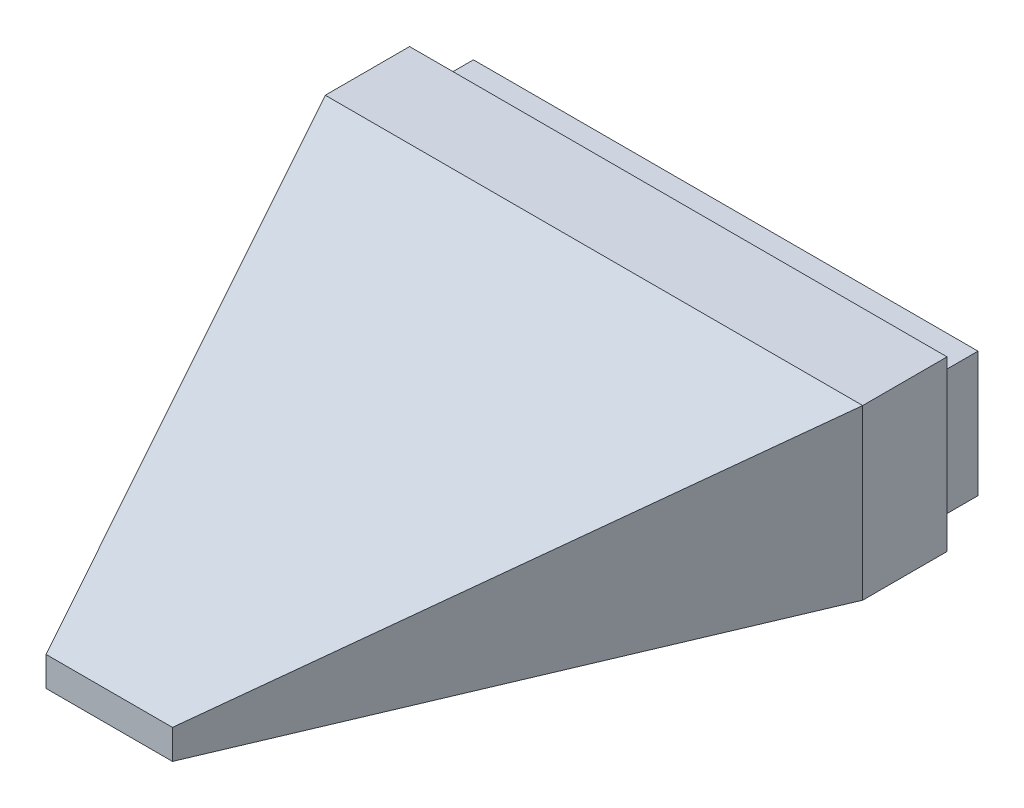
ISO-10303-21;
HEADER;
FILE_DESCRIPTION(('STEP AP214'),'2;1');
FILE_NAME('part.step','',(''),(''),'','','');
FILE_SCHEMA(('AUTOMOTIVE_DESIGN { 1 0 10303 214 1 1 1 1 }'));
ENDSEC;
DATA;
#1=APPLICATION_CONTEXT('core data for automotive mechanical design processes');
#2=APPLICATION_PROTOCOL_DEFINITION('international standard','automotive_design',2000,#1);
#3=PRODUCT_CONTEXT('',#1,'mechanical');
#4=PRODUCT('Part','Part','',(#3));
#5=PRODUCT_RELATED_PRODUCT_CATEGORY('part','',(#4));
#6=PRODUCT_DEFINITION_FORMATION('','',#4);
#7=PRODUCT_DEFINITION_CONTEXT('part definition',#1,'design');
#8=PRODUCT_DEFINITION('design','',#6,#7);
#9=PRODUCT_DEFINITION_SHAPE('','',#8);
#10=(LENGTH_UNIT() NAMED_UNIT(*) SI_UNIT(.MILLI.,.METRE.));
#11=(NAMED_UNIT(*) PLANE_ANGLE_UNIT() SI_UNIT($,.RADIAN.));
#12=(NAMED_UNIT(*) SI_UNIT($,.STERADIAN.) SOLID_ANGLE_UNIT());
#13=UNCERTAINTY_MEASURE_WITH_UNIT(LENGTH_MEASURE(1.E-05),#10,'distance_accuracy_value','');
#14=(GEOMETRIC_REPRESENTATION_CONTEXT(3) GLOBAL_UNCERTAINTY_ASSIGNED_CONTEXT((#13)) GLOBAL_UNIT_ASSIGNED_CONTEXT((#10,
#11,#12)) REPRESENTATION_CONTEXT('',''));
#15=CARTESIAN_POINT('',(0.,0.,0.));
#16=DIRECTION('',(0.,0.,1.));
#17=DIRECTION('',(1.,0.,0.));
#18=AXIS2_PLACEMENT_3D('',#15,#16,#17);
#19=CARTESIAN_POINT('',(0.,0.,0.));
#20=DIRECTION('',(0.,0.,1.));
#21=DIRECTION('',(1.,0.,0.));
#22=AXIS2_PLACEMENT_3D('',#19,#20,#21);
#23=PLANE('',#22);
#24=DIRECTION('',(0.,-1.,0.));
#25=VECTOR('',#24,1.);
#26=CARTESIAN_POINT('',(-63.75,-20.,0.));
#27=LINE('',#26,#25);
#28=CARTESIAN_POINT('',(-63.75,20.,0.));
#29=VERTEX_POINT('',#28);
#30=CARTESIAN_POINT('',(-63.75,-20.,0.));
#31=VERTEX_POINT('',#30);
#32=EDGE_CURVE('E345',#29,#31,#27,.T.);
#33=ORIENTED_EDGE('',*,*,#32,.F.);
#34=DIRECTION('',(-1.,0.,0.));
#35=VECTOR('',#34,1.);
#36=CARTESIAN_POINT('',(63.75,20.,0.));
#37=LINE('',#36,#35);
#38=CARTESIAN_POINT('',(63.75,20.,0.));
#39=VERTEX_POINT('',#38);
#40=EDGE_CURVE('E351',#39,#29,#37,.T.);
#41=ORIENTED_EDGE('',*,*,#40,.F.);
#42=DIRECTION('',(0.,1.,0.));
#43=VECTOR('',#42,1.);
#44=CARTESIAN_POINT('',(63.75,-20.,0.));
#45=LINE('',#44,#43);
#46=CARTESIAN_POINT('',(63.75,-20.,0.));
#47=VERTEX_POINT('',#46);
#48=EDGE_CURVE('E359',#47,#39,#45,.T.);
#49=ORIENTED_EDGE('',*,*,#48,.F.);
#50=DIRECTION('',(1.,0.,0.));
#51=VECTOR('',#50,1.);
#52=CARTESIAN_POINT('',(63.75,-20.,0.));
#53=LINE('',#52,#51);
#54=EDGE_CURVE('E355',#31,#47,#53,.T.);
#55=ORIENTED_EDGE('',*,*,#54,.F.);
#56=EDGE_LOOP('',(#33,#41,#49,#55));
#57=FACE_BOUND('',#56,.T.);
#58=DIRECTION('',(0.,1.,0.));
#59=VECTOR('',#58,1.);
#60=CARTESIAN_POINT('',(-58.6,14.85,0.));
#61=LINE('',#60,#59);
#62=CARTESIAN_POINT('',(-58.6,-14.85,0.));
#63=VERTEX_POINT('',#62);
#64=CARTESIAN_POINT('',(-58.6,14.85,0.));
#65=VERTEX_POINT('',#64);
#66=EDGE_CURVE('E300',#63,#65,#61,.T.);
#67=ORIENTED_EDGE('',*,*,#66,.F.);
#68=DIRECTION('',(-1.,0.,0.));
#69=VECTOR('',#68,1.);
#70=CARTESIAN_POINT('',(-58.6,-14.85,0.));
#71=LINE('',#70,#69);
#72=CARTESIAN_POINT('',(61.1,-14.85,0.));
#73=VERTEX_POINT('',#72);
#74=EDGE_CURVE('E306',#73,#63,#71,.T.);
#75=ORIENTED_EDGE('',*,*,#74,.F.);
#76=DIRECTION('',(0.,-1.,0.));
#77=VECTOR('',#76,1.);
#78=CARTESIAN_POINT('',(61.1,14.85,0.));
#79=LINE('',#78,#77);
#80=CARTESIAN_POINT('',(61.1,14.85,0.));
#81=VERTEX_POINT('',#80);
#82=EDGE_CURVE('E323',#81,#73,#79,.T.);
#83=ORIENTED_EDGE('',*,*,#82,.F.);
#84=DIRECTION('',(1.,0.,0.));
#85=VECTOR('',#84,1.);
#86=CARTESIAN_POINT('',(-58.6,14.85,0.));
#87=LINE('',#86,#85);
#88=EDGE_CURVE('E319',#65,#81,#87,.T.);
#89=ORIENTED_EDGE('',*,*,#88,.F.);
#90=EDGE_LOOP('',(#67,#75,#83,#89));
#91=FACE_BOUND('',#90,.T.);
#92=ADVANCED_FACE('F45',(#57,#91),#23,.F.);
#93=CARTESIAN_POINT('',(-63.75,-20.,135.));
#94=DIRECTION('',(1.,0.,0.));
#95=DIRECTION('',(0.,0.,-1.));
#96=AXIS2_PLACEMENT_3D('',#93,#94,#95);
#97=PLANE('',#96);
#98=DIRECTION('',(0.,0.,-1.));
#99=VECTOR('',#98,1.);
#100=CARTESIAN_POINT('',(-63.75,-20.,135.));
#101=LINE('',#100,#99);
#102=CARTESIAN_POINT('',(-63.75,-20.,20.));
#103=VERTEX_POINT('',#102);
#104=EDGE_CURVE('E374',#103,#31,#101,.T.);
#105=ORIENTED_EDGE('',*,*,#104,.F.);
#106=DIRECTION('',(0.,1.,0.));
#107=VECTOR('',#106,1.);
#108=CARTESIAN_POINT('',(-63.75,-164.,20.));
#109=LINE('',#108,#107);
#110=CARTESIAN_POINT('',(-63.75,20.,20.));
#111=VERTEX_POINT('',#110);
#112=EDGE_CURVE('E276',#103,#111,#109,.T.);
#113=ORIENTED_EDGE('',*,*,#112,.T.);
#114=DIRECTION('',(0.,0.,-1.));
#115=VECTOR('',#114,1.);
#116=CARTESIAN_POINT('',(-63.75,20.,135.));
#117=LINE('',#116,#115);
#118=EDGE_CURVE('E350',#111,#29,#117,.T.);
#119=ORIENTED_EDGE('',*,*,#118,.T.);
#120=ORIENTED_EDGE('',*,*,#32,.T.);
#121=EDGE_LOOP('',(#105,#113,#119,#120));
#122=FACE_BOUND('',#121,.T.);
#123=ADVANCED_FACE('F47',(#122),#97,.F.);
#124=CARTESIAN_POINT('',(63.75,-20.,135.));
#125=DIRECTION('',(0.,1.,0.));
#126=DIRECTION('',(-1.,0.,0.));
#127=AXIS2_PLACEMENT_3D('',#124,#125,#126);
#128=PLANE('',#127);
#129=DIRECTION('',(-0.390292829474369,0.,-0.920690777221588));
#130=VECTOR('',#129,1.);
#131=CARTESIAN_POINT('',(1.59932268931276,-20.,161.346482773009));
#132=LINE('',#131,#130);
#133=CARTESIAN_POINT('',(-11.6888602253323,-20.,130.));
#134=VERTEX_POINT('',#133);
#135=CARTESIAN_POINT('',(-58.75,-20.,18.9839779674504));
#136=VERTEX_POINT('',#135);
#137=EDGE_CURVE('E262',#134,#136,#132,.T.);
#138=ORIENTED_EDGE('',*,*,#137,.F.);
#139=DIRECTION('',(1.,0.,0.));
#140=VECTOR('',#139,1.);
#141=CARTESIAN_POINT('',(63.75,-20.,130.));
#142=LINE('',#141,#140);
#143=CARTESIAN_POINT('',(11.6888602253323,-20.,130.));
#144=VERTEX_POINT('',#143);
#145=EDGE_CURVE('E264',#134,#144,#142,.T.);
#146=ORIENTED_EDGE('',*,*,#145,.T.);
#147=DIRECTION('',(-0.390292829474369,0.,0.920690777221588));
#148=VECTOR('',#147,1.);
#149=CARTESIAN_POINT('',(17.8225601349236,-20.,115.530759187631));
#150=LINE('',#149,#148);
#151=CARTESIAN_POINT('',(58.75,-20.,18.9839779674504));
#152=VERTEX_POINT('',#151);
#153=EDGE_CURVE('E258',#152,#144,#150,.T.);
#154=ORIENTED_EDGE('',*,*,#153,.F.);
#155=DIRECTION('',(0.,0.,-1.));
#156=VECTOR('',#155,1.);
#157=CARTESIAN_POINT('',(58.75,-20.,135.));
#158=LINE('',#157,#156);
#159=CARTESIAN_POINT('',(58.75,-20.,5.));
#160=VERTEX_POINT('',#159);
#161=EDGE_CURVE('E61',#152,#160,#158,.T.);
#162=ORIENTED_EDGE('',*,*,#161,.T.);
#163=DIRECTION('',(1.,0.,0.));
#164=VECTOR('',#163,1.);
#165=CARTESIAN_POINT('',(63.75,-20.,5.));
#166=LINE('',#165,#164);
#167=CARTESIAN_POINT('',(-58.75,-20.,5.));
#168=VERTEX_POINT('',#167);
#169=EDGE_CURVE('E249',#168,#160,#166,.T.);
#170=ORIENTED_EDGE('',*,*,#169,.F.);
#171=DIRECTION('',(0.,0.,-1.));
#172=VECTOR('',#171,1.);
#173=CARTESIAN_POINT('',(-58.75,-20.,135.));
#174=LINE('',#173,#172);
#175=EDGE_CURVE('E256',#136,#168,#174,.T.);
#176=ORIENTED_EDGE('',*,*,#175,.F.);
#177=EDGE_LOOP('',(#138,#146,#154,#162,#170,#176));
#178=FACE_BOUND('',#177,.T.);
#179=DIRECTION('',(1.,0.,0.));
#180=VECTOR('',#179,1.);
#181=CARTESIAN_POINT('',(63.75,-20.,135.));
#182=LINE('',#181,#180);
#183=CARTESIAN_POINT('',(-15.,-20.,135.));
#184=VERTEX_POINT('',#183);
#185=CARTESIAN_POINT('',(15.,-20.,135.));
#186=VERTEX_POINT('',#185);
#187=EDGE_CURVE('E346',#184,#186,#182,.T.);
#188=ORIENTED_EDGE('',*,*,#187,.F.);
#189=DIRECTION('',(-0.390292829474369,0.,-0.920690777221588));
#190=VECTOR('',#189,1.);
#191=CARTESIAN_POINT('',(-3.00413119679517,-20.,163.297946920381));
#192=LINE('',#191,#190);
#193=EDGE_CURVE('E292',#184,#103,#192,.T.);
#194=ORIENTED_EDGE('',*,*,#193,.T.);
#195=ORIENTED_EDGE('',*,*,#104,.T.);
#196=ORIENTED_EDGE('',*,*,#54,.T.);
#197=DIRECTION('',(0.,0.,-1.));
#198=VECTOR('',#197,1.);
#199=CARTESIAN_POINT('',(63.75,-20.,135.));
#200=LINE('',#199,#198);
#201=CARTESIAN_POINT('',(63.75,-20.,20.));
#202=VERTEX_POINT('',#201);
#203=EDGE_CURVE('E371',#202,#47,#200,.T.);
#204=ORIENTED_EDGE('',*,*,#203,.F.);
#205=DIRECTION('',(-0.390292829474369,0.,0.920690777221588));
#206=VECTOR('',#205,1.);
#207=CARTESIAN_POINT('',(22.4260140210315,-20.,117.482223335003));
#208=LINE('',#207,#206);
#209=EDGE_CURVE('E280',#202,#186,#208,.T.);
#210=ORIENTED_EDGE('',*,*,#209,.T.);
#211=EDGE_LOOP('',(#188,#194,#195,#196,#204,#210));
#212=FACE_BOUND('',#211,.T.);
#213=ADVANCED_FACE('F406',(#178,#212),#128,.F.);
#214=CARTESIAN_POINT('',(63.75,-20.,135.));
#215=DIRECTION('',(-1.,0.,0.));
#216=DIRECTION('',(0.,0.,1.));
#217=AXIS2_PLACEMENT_3D('',#214,#215,#216);
#218=PLANE('',#217);
#219=DIRECTION('',(0.,0.,-1.));
#220=VECTOR('',#219,1.);
#221=CARTESIAN_POINT('',(63.75,20.,135.));
#222=LINE('',#221,#220);
#223=CARTESIAN_POINT('',(63.75,20.,20.));
#224=VERTEX_POINT('',#223);
#225=EDGE_CURVE('E368',#224,#39,#222,.T.);
#226=ORIENTED_EDGE('',*,*,#225,.F.);
#227=DIRECTION('',(0.,1.,0.));
#228=VECTOR('',#227,1.);
#229=CARTESIAN_POINT('',(63.75,-164.,20.));
#230=LINE('',#229,#228);
#231=EDGE_CURVE('E248',#202,#224,#230,.T.);
#232=ORIENTED_EDGE('',*,*,#231,.F.);
#233=ORIENTED_EDGE('',*,*,#203,.T.);
#234=ORIENTED_EDGE('',*,*,#48,.T.);
#235=EDGE_LOOP('',(#226,#232,#233,#234));
#236=FACE_BOUND('',#235,.T.);
#237=ADVANCED_FACE('F393',(#236),#218,.F.);
#238=CARTESIAN_POINT('',(63.75,20.,135.));
#239=DIRECTION('',(0.,-1.,0.));
#240=DIRECTION('',(1.,0.,0.));
#241=AXIS2_PLACEMENT_3D('',#238,#239,#240);
#242=PLANE('',#241);
#243=ORIENTED_EDGE('',*,*,#118,.F.);
#244=DIRECTION('',(-1.,0.,0.));
#245=VECTOR('',#244,1.);
#246=CARTESIAN_POINT('',(120.25,20.,20.));
#247=LINE('',#246,#245);
#248=EDGE_CURVE('E296',#224,#111,#247,.T.);
#249=ORIENTED_EDGE('',*,*,#248,.F.);
#250=ORIENTED_EDGE('',*,*,#225,.T.);
#251=ORIENTED_EDGE('',*,*,#40,.T.);
#252=EDGE_LOOP('',(#243,#249,#250,#251));
#253=FACE_BOUND('',#252,.T.);
#254=ADVANCED_FACE('F390',(#253),#242,.F.);
#255=CARTESIAN_POINT('',(0.,0.,135.));
#256=DIRECTION('',(0.,0.,1.));
#257=DIRECTION('',(1.,0.,0.));
#258=AXIS2_PLACEMENT_3D('',#255,#256,#257);
#259=PLANE('',#258);
#260=DIRECTION('',(0.,1.,0.));
#261=VECTOR('',#260,1.);
#262=CARTESIAN_POINT('',(-15.,-164.,135.));
#263=LINE('',#262,#261);
#264=CARTESIAN_POINT('',(-15.,-13.,135.));
#265=VERTEX_POINT('',#264);
#266=EDGE_CURVE('E69',#184,#265,#263,.T.);
#267=ORIENTED_EDGE('',*,*,#266,.F.);
#268=ORIENTED_EDGE('',*,*,#187,.T.);
#269=DIRECTION('',(0.,1.,0.));
#270=VECTOR('',#269,1.);
#271=CARTESIAN_POINT('',(15.,-164.,135.));
#272=LINE('',#271,#270);
#273=CARTESIAN_POINT('',(15.,-13.,135.));
#274=VERTEX_POINT('',#273);
#275=EDGE_CURVE('E283',#186,#274,#272,.T.);
#276=ORIENTED_EDGE('',*,*,#275,.T.);
#277=DIRECTION('',(1.,0.,0.));
#278=VECTOR('',#277,1.);
#279=CARTESIAN_POINT('',(0.,-13.,135.));
#280=LINE('',#279,#278);
#281=EDGE_CURVE('E377',#265,#274,#280,.T.);
#282=ORIENTED_EDGE('',*,*,#281,.F.);
#283=EDGE_LOOP('',(#267,#268,#276,#282));
#284=FACE_BOUND('',#283,.T.);
#285=ADVANCED_FACE('F408',(#284),#259,.T.);
#286=CARTESIAN_POINT('',(-58.6,14.85,-10.));
#287=DIRECTION('',(1.,0.,0.));
#288=DIRECTION('',(0.,1.,0.));
#289=AXIS2_PLACEMENT_3D('',#286,#287,#288);
#290=PLANE('',#289);
#291=ORIENTED_EDGE('',*,*,#66,.T.);
#292=DIRECTION('',(0.,0.,1.));
#293=VECTOR('',#292,1.);
#294=CARTESIAN_POINT('',(-58.6,14.85,-10.));
#295=LINE('',#294,#293);
#296=CARTESIAN_POINT('',(-58.6,14.85,-10.));
#297=VERTEX_POINT('',#296);
#298=EDGE_CURVE('E341',#297,#65,#295,.T.);
#299=ORIENTED_EDGE('',*,*,#298,.F.);
#300=DIRECTION('',(0.,1.,0.));
#301=VECTOR('',#300,1.);
#302=CARTESIAN_POINT('',(-58.6,14.85,-10.));
#303=LINE('',#302,#301);
#304=CARTESIAN_POINT('',(-58.6,-14.85,-10.));
#305=VERTEX_POINT('',#304);
#306=EDGE_CURVE('E301',#305,#297,#303,.T.);
#307=ORIENTED_EDGE('',*,*,#306,.F.);
#308=DIRECTION('',(0.,0.,1.));
#309=VECTOR('',#308,1.);
#310=CARTESIAN_POINT('',(-58.6,-14.85,-10.));
#311=LINE('',#310,#309);
#312=EDGE_CURVE('E315',#305,#63,#311,.T.);
#313=ORIENTED_EDGE('',*,*,#312,.T.);
#314=EDGE_LOOP('',(#291,#299,#307,#313));
#315=FACE_BOUND('',#314,.T.);
#316=ADVANCED_FACE('F656',(#315),#290,.F.);
#317=CARTESIAN_POINT('',(-58.6,14.85,-10.));
#318=DIRECTION('',(0.,-1.,0.));
#319=DIRECTION('',(1.,0.,0.));
#320=AXIS2_PLACEMENT_3D('',#317,#318,#319);
#321=PLANE('',#320);
#322=ORIENTED_EDGE('',*,*,#88,.T.);
#323=DIRECTION('',(0.,0.,1.));
#324=VECTOR('',#323,1.);
#325=CARTESIAN_POINT('',(61.1,14.85,-10.));
#326=LINE('',#325,#324);
#327=CARTESIAN_POINT('',(61.1,14.85,-10.));
#328=VERTEX_POINT('',#327);
#329=EDGE_CURVE('E337',#328,#81,#326,.T.);
#330=ORIENTED_EDGE('',*,*,#329,.F.);
#331=DIRECTION('',(1.,0.,0.));
#332=VECTOR('',#331,1.);
#333=CARTESIAN_POINT('',(-58.6,14.85,-10.));
#334=LINE('',#333,#332);
#335=EDGE_CURVE('E305',#297,#328,#334,.T.);
#336=ORIENTED_EDGE('',*,*,#335,.F.);
#337=ORIENTED_EDGE('',*,*,#298,.T.);
#338=EDGE_LOOP('',(#322,#330,#336,#337));
#339=FACE_BOUND('',#338,.T.);
#340=ADVANCED_FACE('F646',(#339),#321,.F.);
#341=CARTESIAN_POINT('',(61.1,14.85,-10.));
#342=DIRECTION('',(-1.,0.,0.));
#343=DIRECTION('',(0.,-1.,0.));
#344=AXIS2_PLACEMENT_3D('',#341,#342,#343);
#345=PLANE('',#344);
#346=ORIENTED_EDGE('',*,*,#82,.T.);
#347=DIRECTION('',(0.,0.,1.));
#348=VECTOR('',#347,1.);
#349=CARTESIAN_POINT('',(61.1,-14.85,-10.));
#350=LINE('',#349,#348);
#351=CARTESIAN_POINT('',(61.1,-14.85,-10.));
#352=VERTEX_POINT('',#351);
#353=EDGE_CURVE('E333',#352,#73,#350,.T.);
#354=ORIENTED_EDGE('',*,*,#353,.F.);
#355=DIRECTION('',(0.,-1.,0.));
#356=VECTOR('',#355,1.);
#357=CARTESIAN_POINT('',(61.1,14.85,-10.));
#358=LINE('',#357,#356);
#359=EDGE_CURVE('E309',#328,#352,#358,.T.);
#360=ORIENTED_EDGE('',*,*,#359,.F.);
#361=ORIENTED_EDGE('',*,*,#329,.T.);
#362=EDGE_LOOP('',(#346,#354,#360,#361));
#363=FACE_BOUND('',#362,.T.);
#364=ADVANCED_FACE('F636',(#363),#345,.F.);
#365=CARTESIAN_POINT('',(-58.6,-14.85,-10.));
#366=DIRECTION('',(0.,1.,0.));
#367=DIRECTION('',(-1.,0.,0.));
#368=AXIS2_PLACEMENT_3D('',#365,#366,#367);
#369=PLANE('',#368);
#370=ORIENTED_EDGE('',*,*,#74,.T.);
#371=ORIENTED_EDGE('',*,*,#312,.F.);
#372=DIRECTION('',(-1.,0.,0.));
#373=VECTOR('',#372,1.);
#374=CARTESIAN_POINT('',(-58.6,-14.85,-10.));
#375=LINE('',#374,#373);
#376=EDGE_CURVE('E312',#352,#305,#375,.T.);
#377=ORIENTED_EDGE('',*,*,#376,.F.);
#378=ORIENTED_EDGE('',*,*,#353,.T.);
#379=EDGE_LOOP('',(#370,#371,#377,#378));
#380=FACE_BOUND('',#379,.T.);
#381=ADVANCED_FACE('F626',(#380),#369,.F.);
#382=CARTESIAN_POINT('',(0.,0.,-10.));
#383=DIRECTION('',(0.,0.,1.));
#384=DIRECTION('',(1.,0.,0.));
#385=AXIS2_PLACEMENT_3D('',#382,#383,#384);
#386=PLANE('',#385);
#387=ORIENTED_EDGE('',*,*,#306,.T.);
#388=ORIENTED_EDGE('',*,*,#335,.T.);
#389=ORIENTED_EDGE('',*,*,#359,.T.);
#390=ORIENTED_EDGE('',*,*,#376,.T.);
#391=EDGE_LOOP('',(#387,#388,#389,#390));
#392=FACE_BOUND('',#391,.T.);
#393=ADVANCED_FACE('F417',(#392),#386,.F.);
#394=CARTESIAN_POINT('',(120.25,23.7809137906944,6.82408830515579));
#395=DIRECTION('',(0.,-0.961207905262158,-0.275824877162185));
#396=DIRECTION('',(0.,0.275824877162185,-0.961207905262158));
#397=AXIS2_PLACEMENT_3D('',#394,#395,#396);
#398=PLANE('',#397);
#399=ORIENTED_EDGE('',*,*,#248,.T.);
#400=DIRECTION('',(0.377345463617305,-0.255433852294791,0.890148273148515));
#401=VECTOR('',#400,1.);
#402=CARTESIAN_POINT('',(-42.3404459481219,5.50737879565172,70.5045890454561));
#403=LINE('',#402,#401);
#404=EDGE_CURVE('E11',#111,#265,#403,.T.);
#405=ORIENTED_EDGE('',*,*,#404,.T.);
#406=ORIENTED_EDGE('',*,*,#281,.T.);
#407=DIRECTION('',(0.377345463617305,0.255433852294791,-0.890148273148515));
#408=VECTOR('',#407,1.);
#409=CARTESIAN_POINT('',(76.5851444865924,28.6884054986164,-10.2777767376025));
#410=LINE('',#409,#408);
#411=EDGE_CURVE('E54',#274,#224,#410,.T.);
#412=ORIENTED_EDGE('',*,*,#411,.T.);
#413=EDGE_LOOP('',(#399,#405,#406,#412));
#414=FACE_BOUND('',#413,.T.);
#415=ADVANCED_FACE('F384',(#414),#398,.F.);
#416=CARTESIAN_POINT('',(15.,-164.,135.));
#417=DIRECTION('',(-0.920690777221588,0.,-0.390292829474369));
#418=DIRECTION('',(-0.390292829474369,0.,0.920690777221588));
#419=AXIS2_PLACEMENT_3D('',#416,#417,#418);
#420=PLANE('',#419);
#421=ORIENTED_EDGE('',*,*,#231,.T.);
#422=ORIENTED_EDGE('',*,*,#411,.F.);
#423=ORIENTED_EDGE('',*,*,#275,.F.);
#424=ORIENTED_EDGE('',*,*,#209,.F.);
#425=EDGE_LOOP('',(#421,#422,#423,#424));
#426=FACE_BOUND('',#425,.T.);
#427=ADVANCED_FACE('F409',(#426),#420,.F.);
#428=CARTESIAN_POINT('',(-63.75,-164.,20.));
#429=DIRECTION('',(0.920690777221588,0.,-0.390292829474369));
#430=DIRECTION('',(-0.390292829474369,0.,-0.920690777221588));
#431=AXIS2_PLACEMENT_3D('',#428,#429,#430);
#432=PLANE('',#431);
#433=ORIENTED_EDGE('',*,*,#266,.T.);
#434=ORIENTED_EDGE('',*,*,#404,.F.);
#435=ORIENTED_EDGE('',*,*,#112,.F.);
#436=ORIENTED_EDGE('',*,*,#193,.F.);
#437=EDGE_LOOP('',(#433,#434,#435,#436));
#438=FACE_BOUND('',#437,.T.);
#439=ADVANCED_FACE('F403',(#438),#432,.F.);
#440=CARTESIAN_POINT('',(0.,0.,5.));
#441=DIRECTION('',(0.,0.,1.));
#442=DIRECTION('',(1.,0.,0.));
#443=AXIS2_PLACEMENT_3D('',#440,#441,#442);
#444=PLANE('',#443);
#445=DIRECTION('',(0.,-1.,0.));
#446=VECTOR('',#445,1.);
#447=CARTESIAN_POINT('',(-58.75,-20.,5.));
#448=LINE('',#447,#446);
#449=CARTESIAN_POINT('',(-58.75,15.,5.));
#450=VERTEX_POINT('',#449);
#451=EDGE_CURVE('E253',#450,#168,#448,.T.);
#452=ORIENTED_EDGE('',*,*,#451,.T.);
#453=ORIENTED_EDGE('',*,*,#169,.T.);
#454=DIRECTION('',(0.,1.,0.));
#455=VECTOR('',#454,1.);
#456=CARTESIAN_POINT('',(58.75,-20.,5.));
#457=LINE('',#456,#455);
#458=CARTESIAN_POINT('',(58.75,15.,5.));
#459=VERTEX_POINT('',#458);
#460=EDGE_CURVE('E252',#160,#459,#457,.T.);
#461=ORIENTED_EDGE('',*,*,#460,.T.);
#462=DIRECTION('',(-1.,0.,0.));
#463=VECTOR('',#462,1.);
#464=CARTESIAN_POINT('',(63.75,15.,5.));
#465=LINE('',#464,#463);
#466=EDGE_CURVE('E269',#459,#450,#465,.T.);
#467=ORIENTED_EDGE('',*,*,#466,.T.);
#468=EDGE_LOOP('',(#452,#453,#461,#467));
#469=FACE_BOUND('',#468,.T.);
#470=DIRECTION('',(0.,1.,0.));
#471=VECTOR('',#470,1.);
#472=CARTESIAN_POINT('',(-53.6,0.,5.));
#473=LINE('',#472,#471);
#474=CARTESIAN_POINT('',(-53.6,-9.85000000000001,5.));
#475=VERTEX_POINT('',#474);
#476=CARTESIAN_POINT('',(-53.6,9.85000000000001,5.));
#477=VERTEX_POINT('',#476);
#478=EDGE_CURVE('E191',#475,#477,#473,.T.);
#479=ORIENTED_EDGE('',*,*,#478,.T.);
#480=DIRECTION('',(1.,0.,0.));
#481=VECTOR('',#480,1.);
#482=CARTESIAN_POINT('',(0.,9.85,5.));
#483=LINE('',#482,#481);
#484=CARTESIAN_POINT('',(56.1,9.85,5.));
#485=VERTEX_POINT('',#484);
#486=EDGE_CURVE('E203',#477,#485,#483,.T.);
#487=ORIENTED_EDGE('',*,*,#486,.T.);
#488=DIRECTION('',(0.,-1.,0.));
#489=VECTOR('',#488,1.);
#490=CARTESIAN_POINT('',(56.1,0.,5.));
#491=LINE('',#490,#489);
#492=CARTESIAN_POINT('',(56.1,-9.85000000000002,5.));
#493=VERTEX_POINT('',#492);
#494=EDGE_CURVE('E209',#485,#493,#491,.T.);
#495=ORIENTED_EDGE('',*,*,#494,.T.);
#496=DIRECTION('',(-1.,0.,0.));
#497=VECTOR('',#496,1.);
#498=CARTESIAN_POINT('',(0.,-9.85000000000002,5.));
#499=LINE('',#498,#497);
#500=EDGE_CURVE('E207',#493,#475,#499,.T.);
#501=ORIENTED_EDGE('',*,*,#500,.T.);
#502=EDGE_LOOP('',(#479,#487,#495,#501));
#503=FACE_BOUND('',#502,.T.);
#504=ADVANCED_FACE('F208',(#469,#503),#444,.T.);
#505=CARTESIAN_POINT('',(-58.75,-20.,135.));
#506=DIRECTION('',(1.,0.,0.));
#507=DIRECTION('',(0.,0.,-1.));
#508=AXIS2_PLACEMENT_3D('',#505,#506,#507);
#509=PLANE('',#508);
#510=ORIENTED_EDGE('',*,*,#175,.T.);
#511=ORIENTED_EDGE('',*,*,#451,.F.);
#512=DIRECTION('',(0.,0.,-1.));
#513=VECTOR('',#512,1.);
#514=CARTESIAN_POINT('',(-58.75,15.,135.));
#515=LINE('',#514,#513);
#516=CARTESIAN_POINT('',(-58.75,15.,18.9839779674505));
#517=VERTEX_POINT('',#516);
#518=EDGE_CURVE('E268',#517,#450,#515,.T.);
#519=ORIENTED_EDGE('',*,*,#518,.F.);
#520=DIRECTION('',(0.,1.,0.));
#521=VECTOR('',#520,1.);
#522=CARTESIAN_POINT('',(-58.75,-20.,18.9839779674504));
#523=LINE('',#522,#521);
#524=EDGE_CURVE('E263',#136,#517,#523,.T.);
#525=ORIENTED_EDGE('',*,*,#524,.F.);
#526=EDGE_LOOP('',(#510,#511,#519,#525));
#527=FACE_BOUND('',#526,.T.);
#528=ADVANCED_FACE('F502',(#527),#509,.T.);
#529=CARTESIAN_POINT('',(58.75,-20.,135.));
#530=DIRECTION('',(-1.,0.,0.));
#531=DIRECTION('',(0.,0.,1.));
#532=AXIS2_PLACEMENT_3D('',#529,#530,#531);
#533=PLANE('',#532);
#534=DIRECTION('',(0.,0.,-1.));
#535=VECTOR('',#534,1.);
#536=CARTESIAN_POINT('',(58.75,15.,135.));
#537=LINE('',#536,#535);
#538=CARTESIAN_POINT('',(58.75,15.,18.9839779674504));
#539=VERTEX_POINT('',#538);
#540=EDGE_CURVE('E257',#539,#459,#537,.T.);
#541=ORIENTED_EDGE('',*,*,#540,.T.);
#542=ORIENTED_EDGE('',*,*,#460,.F.);
#543=ORIENTED_EDGE('',*,*,#161,.F.);
#544=DIRECTION('',(0.,1.,0.));
#545=VECTOR('',#544,1.);
#546=CARTESIAN_POINT('',(58.75,-164.,18.9839779674505));
#547=LINE('',#546,#545);
#548=EDGE_CURVE('E458',#152,#539,#547,.T.);
#549=ORIENTED_EDGE('',*,*,#548,.T.);
#550=EDGE_LOOP('',(#541,#542,#543,#549));
#551=FACE_BOUND('',#550,.T.);
#552=ADVANCED_FACE('F467',(#551),#533,.T.);
#553=CARTESIAN_POINT('',(63.75,15.,135.));
#554=DIRECTION('',(0.,-1.,0.));
#555=DIRECTION('',(1.,0.,0.));
#556=AXIS2_PLACEMENT_3D('',#553,#554,#555);
#557=PLANE('',#556);
#558=ORIENTED_EDGE('',*,*,#518,.T.);
#559=ORIENTED_EDGE('',*,*,#466,.F.);
#560=ORIENTED_EDGE('',*,*,#540,.F.);
#561=DIRECTION('',(-0.390292829474369,0.,0.920690777221588));
#562=VECTOR('',#561,1.);
#563=CARTESIAN_POINT('',(10.3965461138921,15.,133.048535852628));
#564=LINE('',#563,#562);
#565=CARTESIAN_POINT('',(58.6173913057152,15.,19.2967984770454));
#566=VERTEX_POINT('',#565);
#567=EDGE_CURVE('E243',#539,#566,#564,.T.);
#568=ORIENTED_EDGE('',*,*,#567,.T.);
#569=DIRECTION('',(-1.,0.,0.));
#570=VECTOR('',#569,1.);
#571=CARTESIAN_POINT('',(120.25,15.,19.2967984770453));
#572=LINE('',#571,#570);
#573=CARTESIAN_POINT('',(-58.6173913057152,15.,19.2967984770454));
#574=VERTEX_POINT('',#573);
#575=EDGE_CURVE('E204',#566,#574,#572,.T.);
#576=ORIENTED_EDGE('',*,*,#575,.T.);
#577=DIRECTION('',(0.390292829474369,0.,0.920690777221588));
#578=VECTOR('',#577,1.);
#579=CARTESIAN_POINT('',(1.59932268931275,15.,161.346482773009));
#580=LINE('',#579,#578);
#581=EDGE_CURVE('E239',#517,#574,#580,.T.);
#582=ORIENTED_EDGE('',*,*,#581,.F.);
#583=EDGE_LOOP('',(#558,#559,#560,#568,#576,#582));
#584=FACE_BOUND('',#583,.T.);
#585=ADVANCED_FACE('F500',(#584),#557,.T.);
#586=CARTESIAN_POINT('',(0.,0.,130.));
#587=DIRECTION('',(0.,0.,1.));
#588=DIRECTION('',(1.,0.,0.));
#589=AXIS2_PLACEMENT_3D('',#586,#587,#588);
#590=PLANE('',#589);
#591=DIRECTION('',(0.,1.,0.));
#592=VECTOR('',#591,1.);
#593=CARTESIAN_POINT('',(-11.6888602253323,0.,130.));
#594=LINE('',#593,#592);
#595=CARTESIAN_POINT('',(-11.6888602253323,-16.7670056544131,130.));
#596=VERTEX_POINT('',#595);
#597=EDGE_CURVE('E446',#134,#596,#594,.T.);
#598=ORIENTED_EDGE('',*,*,#597,.T.);
#599=DIRECTION('',(1.,0.,0.));
#600=VECTOR('',#599,1.);
#601=CARTESIAN_POINT('',(0.,-16.7670056544131,130.));
#602=LINE('',#601,#600);
#603=CARTESIAN_POINT('',(11.6888602253323,-16.7670056544131,130.));
#604=VERTEX_POINT('',#603);
#605=EDGE_CURVE('E275',#596,#604,#602,.T.);
#606=ORIENTED_EDGE('',*,*,#605,.T.);
#607=DIRECTION('',(0.,1.,0.));
#608=VECTOR('',#607,1.);
#609=CARTESIAN_POINT('',(11.6888602253323,-164.,130.));
#610=LINE('',#609,#608);
#611=EDGE_CURVE('E451',#144,#604,#610,.T.);
#612=ORIENTED_EDGE('',*,*,#611,.F.);
#613=ORIENTED_EDGE('',*,*,#145,.F.);
#614=EDGE_LOOP('',(#598,#606,#612,#613));
#615=FACE_BOUND('',#614,.T.);
#616=ADVANCED_FACE('F453',(#615),#590,.F.);
#617=CARTESIAN_POINT('',(-53.6,14.85,-10.));
#618=DIRECTION('',(1.,0.,0.));
#619=DIRECTION('',(0.,1.,0.));
#620=AXIS2_PLACEMENT_3D('',#617,#618,#619);
#621=PLANE('',#620);
#622=ORIENTED_EDGE('',*,*,#478,.F.);
#623=DIRECTION('',(0.,0.,1.));
#624=VECTOR('',#623,1.);
#625=CARTESIAN_POINT('',(-53.6,-9.85000000000001,-10.));
#626=LINE('',#625,#624);
#627=CARTESIAN_POINT('',(-53.6,-9.85000000000001,-5.));
#628=VERTEX_POINT('',#627);
#629=EDGE_CURVE('E196',#628,#475,#626,.T.);
#630=ORIENTED_EDGE('',*,*,#629,.F.);
#631=DIRECTION('',(0.,1.,0.));
#632=VECTOR('',#631,1.);
#633=CARTESIAN_POINT('',(-53.6,0.,-5.));
#634=LINE('',#633,#632);
#635=CARTESIAN_POINT('',(-53.6,9.85000000000001,-5.));
#636=VERTEX_POINT('',#635);
#637=EDGE_CURVE('E214',#628,#636,#634,.T.);
#638=ORIENTED_EDGE('',*,*,#637,.T.);
#639=DIRECTION('',(0.,0.,1.));
#640=VECTOR('',#639,1.);
#641=CARTESIAN_POINT('',(-53.6,9.85000000000001,-10.));
#642=LINE('',#641,#640);
#643=EDGE_CURVE('E199',#636,#477,#642,.T.);
#644=ORIENTED_EDGE('',*,*,#643,.T.);
#645=EDGE_LOOP('',(#622,#630,#638,#644));
#646=FACE_BOUND('',#645,.T.);
#647=ADVANCED_FACE('F193',(#646),#621,.T.);
#648=CARTESIAN_POINT('',(-58.6,9.85000000000001,-10.));
#649=DIRECTION('',(0.,-1.,0.));
#650=DIRECTION('',(1.,0.,0.));
#651=AXIS2_PLACEMENT_3D('',#648,#649,#650);
#652=PLANE('',#651);
#653=ORIENTED_EDGE('',*,*,#486,.F.);
#654=ORIENTED_EDGE('',*,*,#643,.F.);
#655=DIRECTION('',(1.,0.,0.));
#656=VECTOR('',#655,1.);
#657=CARTESIAN_POINT('',(0.,9.85,-5.));
#658=LINE('',#657,#656);
#659=CARTESIAN_POINT('',(56.1,9.85,-5.));
#660=VERTEX_POINT('',#659);
#661=EDGE_CURVE('E234',#636,#660,#658,.T.);
#662=ORIENTED_EDGE('',*,*,#661,.T.);
#663=DIRECTION('',(0.,0.,1.));
#664=VECTOR('',#663,1.);
#665=CARTESIAN_POINT('',(56.1,9.85,-10.));
#666=LINE('',#665,#664);
#667=EDGE_CURVE('E224',#660,#485,#666,.T.);
#668=ORIENTED_EDGE('',*,*,#667,.T.);
#669=EDGE_LOOP('',(#653,#654,#662,#668));
#670=FACE_BOUND('',#669,.T.);
#671=ADVANCED_FACE('F517',(#670),#652,.T.);
#672=CARTESIAN_POINT('',(56.1,14.85,-10.));
#673=DIRECTION('',(-1.,0.,0.));
#674=DIRECTION('',(0.,-1.,0.));
#675=AXIS2_PLACEMENT_3D('',#672,#673,#674);
#676=PLANE('',#675);
#677=ORIENTED_EDGE('',*,*,#494,.F.);
#678=ORIENTED_EDGE('',*,*,#667,.F.);
#679=DIRECTION('',(0.,-1.,0.));
#680=VECTOR('',#679,1.);
#681=CARTESIAN_POINT('',(56.1,0.,-5.));
#682=LINE('',#681,#680);
#683=CARTESIAN_POINT('',(56.1,-9.85000000000002,-5.));
#684=VERTEX_POINT('',#683);
#685=EDGE_CURVE('E226',#660,#684,#682,.T.);
#686=ORIENTED_EDGE('',*,*,#685,.T.);
#687=DIRECTION('',(0.,0.,1.));
#688=VECTOR('',#687,1.);
#689=CARTESIAN_POINT('',(56.1,-9.85000000000002,-10.));
#690=LINE('',#689,#688);
#691=EDGE_CURVE('E220',#684,#493,#690,.T.);
#692=ORIENTED_EDGE('',*,*,#691,.T.);
#693=EDGE_LOOP('',(#677,#678,#686,#692));
#694=FACE_BOUND('',#693,.T.);
#695=ADVANCED_FACE('F520',(#694),#676,.T.);
#696=CARTESIAN_POINT('',(-58.6,-9.85000000000001,-10.));
#697=DIRECTION('',(0.,1.,0.));
#698=DIRECTION('',(-1.,0.,0.));
#699=AXIS2_PLACEMENT_3D('',#696,#697,#698);
#700=PLANE('',#699);
#701=ORIENTED_EDGE('',*,*,#500,.F.);
#702=ORIENTED_EDGE('',*,*,#691,.F.);
#703=DIRECTION('',(-1.,0.,0.));
#704=VECTOR('',#703,1.);
#705=CARTESIAN_POINT('',(0.,-9.85000000000002,-5.));
#706=LINE('',#705,#704);
#707=EDGE_CURVE('E218',#684,#628,#706,.T.);
#708=ORIENTED_EDGE('',*,*,#707,.T.);
#709=ORIENTED_EDGE('',*,*,#629,.T.);
#710=EDGE_LOOP('',(#701,#702,#708,#709));
#711=FACE_BOUND('',#710,.T.);
#712=ADVANCED_FACE('F216',(#711),#700,.T.);
#713=CARTESIAN_POINT('',(0.,0.,-5.));
#714=DIRECTION('',(0.,0.,1.));
#715=DIRECTION('',(1.,0.,0.));
#716=AXIS2_PLACEMENT_3D('',#713,#714,#715);
#717=PLANE('',#716);
#718=ORIENTED_EDGE('',*,*,#637,.F.);
#719=ORIENTED_EDGE('',*,*,#707,.F.);
#720=ORIENTED_EDGE('',*,*,#685,.F.);
#721=ORIENTED_EDGE('',*,*,#661,.F.);
#722=EDGE_LOOP('',(#718,#719,#720,#721));
#723=FACE_BOUND('',#722,.T.);
#724=ADVANCED_FACE('F527',(#723),#717,.T.);
#725=CARTESIAN_POINT('',(120.25,18.9748742643836,5.44496391934487));
#726=DIRECTION('',(0.,-0.961207905262158,-0.275824877162185));
#727=DIRECTION('',(0.,0.275824877162185,-0.961207905262158));
#728=AXIS2_PLACEMENT_3D('',#725,#726,#727);
#729=PLANE('',#728);
#730=ORIENTED_EDGE('',*,*,#575,.F.);
#731=DIRECTION('',(0.377345463617305,0.255433852294791,-0.890148273148515));
#732=VECTOR('',#731,1.);
#733=CARTESIAN_POINT('',(72.4290991533055,24.3494637737535,-13.2846661890652));
#734=LINE('',#733,#732);
#735=EDGE_CURVE('E492',#604,#566,#734,.T.);
#736=ORIENTED_EDGE('',*,*,#735,.F.);
#737=ORIENTED_EDGE('',*,*,#605,.F.);
#738=DIRECTION('',(0.377345463617305,-0.255433852294791,0.890148273148515));
#739=VECTOR('',#738,1.);
#740=CARTESIAN_POINT('',(-38.184400614835,1.16843707078882,67.4976995939934));
#741=LINE('',#740,#739);
#742=EDGE_CURVE('E244',#574,#596,#741,.T.);
#743=ORIENTED_EDGE('',*,*,#742,.F.);
#744=EDGE_LOOP('',(#730,#736,#737,#743));
#745=FACE_BOUND('',#744,.T.);
#746=ADVANCED_FACE('F530',(#745),#729,.T.);
#747=CARTESIAN_POINT('',(10.3965461138921,-164.,133.048535852628));
#748=DIRECTION('',(-0.920690777221588,0.,-0.390292829474369));
#749=DIRECTION('',(-0.390292829474369,0.,0.920690777221588));
#750=AXIS2_PLACEMENT_3D('',#747,#748,#749);
#751=PLANE('',#750);
#752=ORIENTED_EDGE('',*,*,#548,.F.);
#753=ORIENTED_EDGE('',*,*,#153,.T.);
#754=ORIENTED_EDGE('',*,*,#611,.T.);
#755=ORIENTED_EDGE('',*,*,#735,.T.);
#756=ORIENTED_EDGE('',*,*,#567,.F.);
#757=EDGE_LOOP('',(#752,#753,#754,#755,#756));
#758=FACE_BOUND('',#757,.T.);
#759=ADVANCED_FACE('F460',(#758),#751,.T.);
#760=CARTESIAN_POINT('',(-59.146546113892,-164.,18.0485358526282));
#761=DIRECTION('',(0.920690777221588,0.,-0.390292829474369));
#762=DIRECTION('',(-0.390292829474369,0.,-0.920690777221588));
#763=AXIS2_PLACEMENT_3D('',#760,#761,#762);
#764=PLANE('',#763);
#765=ORIENTED_EDGE('',*,*,#597,.F.);
#766=ORIENTED_EDGE('',*,*,#137,.T.);
#767=ORIENTED_EDGE('',*,*,#524,.T.);
#768=ORIENTED_EDGE('',*,*,#581,.T.);
#769=ORIENTED_EDGE('',*,*,#742,.T.);
#770=EDGE_LOOP('',(#765,#766,#767,#768,#769));
#771=FACE_BOUND('',#770,.T.);
#772=ADVANCED_FACE('F443',(#771),#764,.T.);
#773=CLOSED_SHELL('',(#92,#123,#213,#237,#254,#285,#316,#340,#364,#381,#393,#415,#427,#439,#504,
#528,#552,#585,#616,#647,#671,#695,#712,#724,#746,#759,#772));
#774=MANIFOLD_SOLID_BREP('B2',#773);
#775=ADVANCED_BREP_SHAPE_REPRESENTATION('',(#18,#774),#14);
#776=SHAPE_DEFINITION_REPRESENTATION(#9,#775);
ENDSEC;
END-ISO-10303-21;
